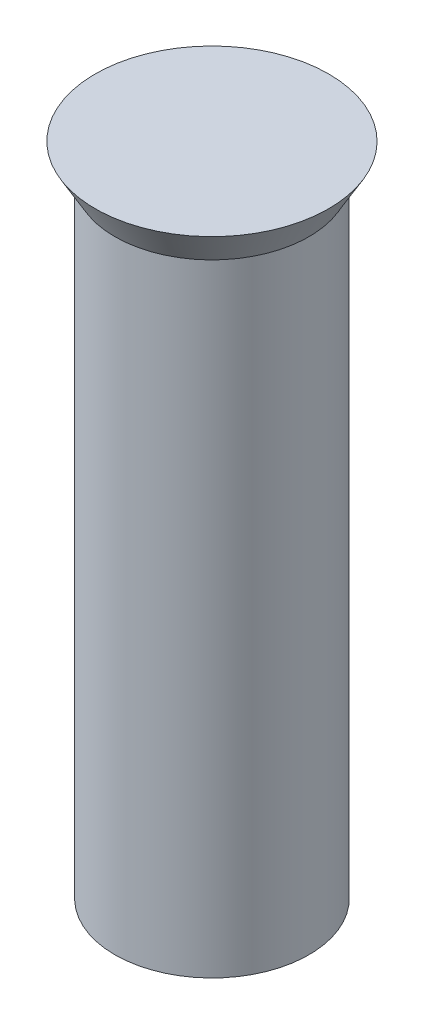
ISO-10303-21;
HEADER;
FILE_DESCRIPTION(('STEP AP214'),'2;1');
FILE_NAME('part.step','',(''),(''),'','','');
FILE_SCHEMA(('AUTOMOTIVE_DESIGN { 1 0 10303 214 1 1 1 1 }'));
ENDSEC;
DATA;
#1=APPLICATION_CONTEXT('core data for automotive mechanical design processes');
#2=APPLICATION_PROTOCOL_DEFINITION('international standard','automotive_design',2000,#1);
#3=PRODUCT_CONTEXT('',#1,'mechanical');
#4=PRODUCT('Part','Part','',(#3));
#5=PRODUCT_RELATED_PRODUCT_CATEGORY('part','',(#4));
#6=PRODUCT_DEFINITION_FORMATION('','',#4);
#7=PRODUCT_DEFINITION_CONTEXT('part definition',#1,'design');
#8=PRODUCT_DEFINITION('design','',#6,#7);
#9=PRODUCT_DEFINITION_SHAPE('','',#8);
#10=(LENGTH_UNIT() NAMED_UNIT(*) SI_UNIT(.MILLI.,.METRE.));
#11=(NAMED_UNIT(*) PLANE_ANGLE_UNIT() SI_UNIT($,.RADIAN.));
#12=(NAMED_UNIT(*) SI_UNIT($,.STERADIAN.) SOLID_ANGLE_UNIT());
#13=UNCERTAINTY_MEASURE_WITH_UNIT(LENGTH_MEASURE(1.E-05),#10,'distance_accuracy_value','');
#14=(GEOMETRIC_REPRESENTATION_CONTEXT(3) GLOBAL_UNCERTAINTY_ASSIGNED_CONTEXT((#13)) GLOBAL_UNIT_ASSIGNED_CONTEXT((#10,
#11,#12)) REPRESENTATION_CONTEXT('',''));
#15=CARTESIAN_POINT('',(0.,0.,0.));
#16=DIRECTION('',(0.,0.,1.));
#17=DIRECTION('',(1.,0.,0.));
#18=AXIS2_PLACEMENT_3D('',#15,#16,#17);
#19=CARTESIAN_POINT('',(0.,6.35,0.));
#20=DIRECTION('',(0.,1.,0.));
#21=DIRECTION('',(0.,0.,1.));
#22=AXIS2_PLACEMENT_3D('',#19,#20,#21);
#23=PLANE('',#22);
#24=CARTESIAN_POINT('',(0.,6.35,0.));
#25=DIRECTION('',(0.,-1.,0.));
#26=DIRECTION('',(0.,0.,-1.));
#27=AXIS2_PLACEMENT_3D('',#24,#25,#26);
#28=CIRCLE('',#27,1.1303);
#29=CARTESIAN_POINT('',(0.,6.35,-1.1303));
#30=VERTEX_POINT('',#29);
#31=EDGE_CURVE('E10',#30,#30,#28,.T.);
#32=ORIENTED_EDGE('',*,*,#31,.F.);
#33=EDGE_LOOP('',(#32));
#34=FACE_BOUND('',#33,.T.);
#35=ADVANCED_FACE('F30',(#34),#23,.T.);
#36=CARTESIAN_POINT('',(0.,6.02004432115812,0.));
#37=DIRECTION('',(0.,1.,0.));
#38=DIRECTION('',(0.,0.,1.));
#39=AXIS2_PLACEMENT_3D('',#36,#37,#38);
#40=CONICAL_SURFACE('',#39,0.9398,0.523598775598294);
#41=ORIENTED_EDGE('',*,*,#31,.T.);
#42=EDGE_LOOP('',(#41));
#43=FACE_BOUND('',#42,.T.);
#44=CARTESIAN_POINT('',(0.,6.02004432115812,0.));
#45=DIRECTION('',(0.,-1.,0.));
#46=DIRECTION('',(0.,0.,-1.));
#47=AXIS2_PLACEMENT_3D('',#44,#45,#46);
#48=CIRCLE('',#47,0.9398);
#49=CARTESIAN_POINT('',(0.,6.02004432115812,-0.9398));
#50=VERTEX_POINT('',#49);
#51=EDGE_CURVE('E36',#50,#50,#48,.T.);
#52=ORIENTED_EDGE('',*,*,#51,.F.);
#53=EDGE_LOOP('',(#52));
#54=FACE_BOUND('',#53,.T.);
#55=ADVANCED_FACE('F51',(#43,#54),#40,.T.);
#56=CARTESIAN_POINT('',(0.,0.,0.));
#57=DIRECTION('',(0.,-1.,0.));
#58=DIRECTION('',(0.,0.,-1.));
#59=AXIS2_PLACEMENT_3D('',#56,#57,#58);
#60=CYLINDRICAL_SURFACE('',#59,0.9398);
#61=ORIENTED_EDGE('',*,*,#51,.T.);
#62=EDGE_LOOP('',(#61));
#63=FACE_BOUND('',#62,.T.);
#64=CARTESIAN_POINT('',(0.,0.,0.));
#65=DIRECTION('',(0.,-1.,0.));
#66=DIRECTION('',(0.,0.,-1.));
#67=AXIS2_PLACEMENT_3D('',#64,#65,#66);
#68=CIRCLE('',#67,0.9398);
#69=CARTESIAN_POINT('',(0.,0.,-0.9398));
#70=VERTEX_POINT('',#69);
#71=EDGE_CURVE('E40',#70,#70,#68,.T.);
#72=ORIENTED_EDGE('',*,*,#71,.F.);
#73=EDGE_LOOP('',(#72));
#74=FACE_BOUND('',#73,.T.);
#75=ADVANCED_FACE('F49',(#63,#74),#60,.T.);
#76=CARTESIAN_POINT('',(0.9398,0.,0.));
#77=DIRECTION('',(0.,-1.,0.));
#78=DIRECTION('',(0.,0.,-1.));
#79=AXIS2_PLACEMENT_3D('',#76,#77,#78);
#80=PLANE('',#79);
#81=ORIENTED_EDGE('',*,*,#71,.T.);
#82=EDGE_LOOP('',(#81));
#83=FACE_BOUND('',#82,.T.);
#84=ADVANCED_FACE('F47',(#83),#80,.T.);
#85=CLOSED_SHELL('',(#35,#55,#75,#84));
#86=MANIFOLD_SOLID_BREP('B2',#85);
#87=ADVANCED_BREP_SHAPE_REPRESENTATION('',(#18,#86),#14);
#88=SHAPE_DEFINITION_REPRESENTATION(#9,#87);
ENDSEC;
END-ISO-10303-21;
